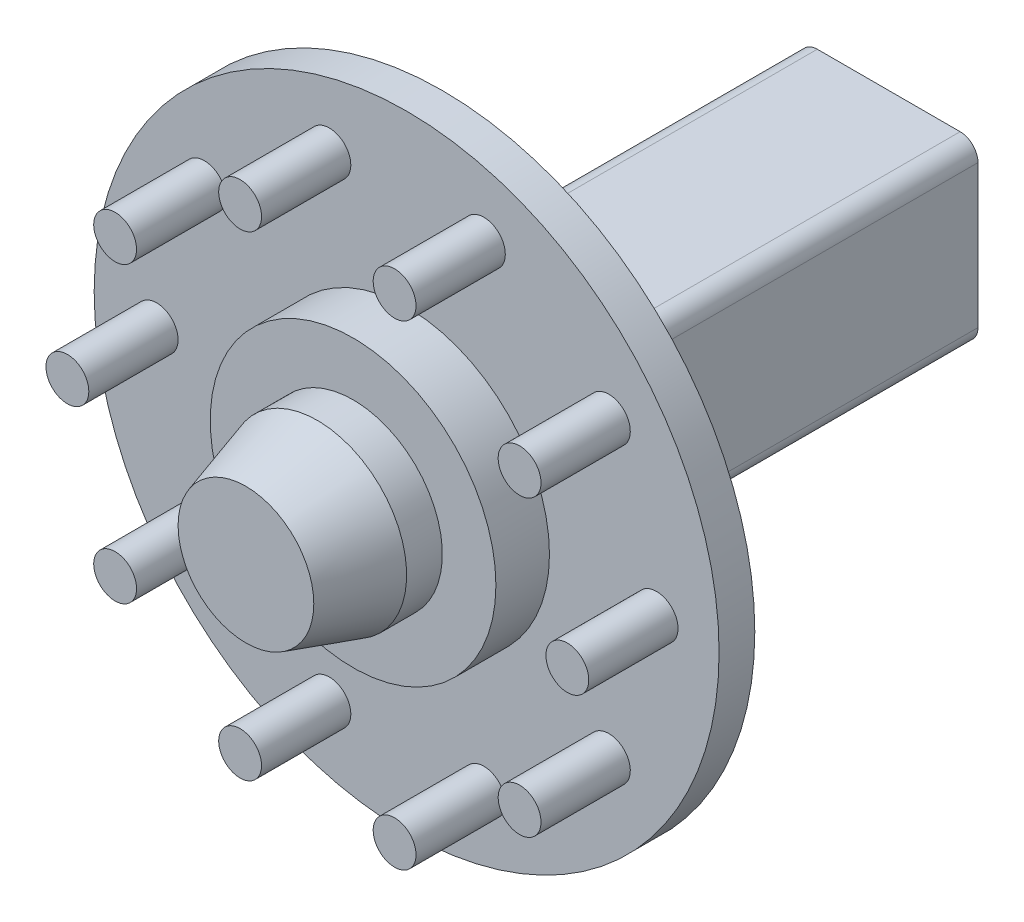
ISO-10303-21;
HEADER;
FILE_DESCRIPTION(('STEP AP214'),'2;1');
FILE_NAME('part.step','',(''),(''),'','','');
FILE_SCHEMA(('AUTOMOTIVE_DESIGN { 1 0 10303 214 1 1 1 1 }'));
ENDSEC;
DATA;
#1=APPLICATION_CONTEXT('core data for automotive mechanical design processes');
#2=APPLICATION_PROTOCOL_DEFINITION('international standard','automotive_design',2000,#1);
#3=PRODUCT_CONTEXT('',#1,'mechanical');
#4=PRODUCT('Part','Part','',(#3));
#5=PRODUCT_RELATED_PRODUCT_CATEGORY('part','',(#4));
#6=PRODUCT_DEFINITION_FORMATION('','',#4);
#7=PRODUCT_DEFINITION_CONTEXT('part definition',#1,'design');
#8=PRODUCT_DEFINITION('design','',#6,#7);
#9=PRODUCT_DEFINITION_SHAPE('','',#8);
#10=(LENGTH_UNIT() NAMED_UNIT(*) SI_UNIT(.MILLI.,.METRE.));
#11=(NAMED_UNIT(*) PLANE_ANGLE_UNIT() SI_UNIT($,.RADIAN.));
#12=(NAMED_UNIT(*) SI_UNIT($,.STERADIAN.) SOLID_ANGLE_UNIT());
#13=UNCERTAINTY_MEASURE_WITH_UNIT(LENGTH_MEASURE(1.E-05),#10,'distance_accuracy_value','');
#14=(GEOMETRIC_REPRESENTATION_CONTEXT(3) GLOBAL_UNCERTAINTY_ASSIGNED_CONTEXT((#13)) GLOBAL_UNIT_ASSIGNED_CONTEXT((#10,
#11,#12)) REPRESENTATION_CONTEXT('',''));
#15=CARTESIAN_POINT('',(0.,0.,0.));
#16=DIRECTION('',(0.,0.,1.));
#17=DIRECTION('',(1.,0.,0.));
#18=AXIS2_PLACEMENT_3D('',#15,#16,#17);
#19=CARTESIAN_POINT('',(50.0000000000001,50.0000000000002,270.));
#20=DIRECTION('',(0.,0.,1.));
#21=DIRECTION('',(1.,0.,0.));
#22=AXIS2_PLACEMENT_3D('',#19,#20,#21);
#23=PLANE('',#22);
#24=CARTESIAN_POINT('',(6.73762078750573,183.147912281322,270.));
#25=DIRECTION('',(0.,0.,1.));
#26=DIRECTION('',(0.309016994374959,-0.951056516295155,0.));
#27=AXIS2_PLACEMENT_3D('',#24,#25,#26);
#28=CIRCLE('',#27,12.);
#29=CARTESIAN_POINT('',(10.4458247200052,171.73523408578,270.));
#30=VERTEX_POINT('',#29);
#31=EDGE_CURVE('E693',#30,#30,#28,.T.);
#32=ORIENTED_EDGE('',*,*,#31,.F.);
#33=EDGE_LOOP('',(#32));
#34=FACE_BOUND('',#33,.T.);
#35=CARTESIAN_POINT('',(163.262379212492,132.289935320948,270.));
#36=DIRECTION('',(0.,0.,1.));
#37=DIRECTION('',(-0.809016994374945,-0.587785252292483,0.));
#38=AXIS2_PLACEMENT_3D('',#35,#36,#37);
#39=CIRCLE('',#38,12.);
#40=CARTESIAN_POINT('',(153.554175279993,125.236512293438,270.));
#41=VERTEX_POINT('',#40);
#42=EDGE_CURVE('E681',#41,#41,#39,.T.);
#43=ORIENTED_EDGE('',*,*,#42,.F.);
#44=EDGE_LOOP('',(#43));
#45=FACE_BOUND('',#44,.T.);
#46=CARTESIAN_POINT('',(163.262379212494,-32.2899353209456,270.));
#47=DIRECTION('',(0.,0.,1.));
#48=DIRECTION('',(-0.809016994374953,0.587785252292471,0.));
#49=AXIS2_PLACEMENT_3D('',#46,#47,#48);
#50=CIRCLE('',#49,12.);
#51=CARTESIAN_POINT('',(153.554175279994,-25.236512293436,270.));
#52=VERTEX_POINT('',#51);
#53=EDGE_CURVE('E669',#52,#52,#50,.T.);
#54=ORIENTED_EDGE('',*,*,#53,.F.);
#55=EDGE_LOOP('',(#54));
#56=FACE_BOUND('',#55,.T.);
#57=CARTESIAN_POINT('',(6.73762078750775,-83.1479122813219,270.));
#58=DIRECTION('',(0.,0.,1.));
#59=DIRECTION('',(0.309016994374945,0.951056516295159,0.));
#60=AXIS2_PLACEMENT_3D('',#57,#58,#59);
#61=CIRCLE('',#60,12.);
#62=CARTESIAN_POINT('',(10.4458247200071,-71.73523408578,270.));
#63=VERTEX_POINT('',#62);
#64=EDGE_CURVE('E657',#63,#63,#61,.T.);
#65=ORIENTED_EDGE('',*,*,#64,.F.);
#66=EDGE_LOOP('',(#65));
#67=FACE_BOUND('',#66,.T.);
#68=CARTESIAN_POINT('',(-90.0000000000002,50.0000000000003,270.));
#69=DIRECTION('',(0.,0.,1.));
#70=DIRECTION('',(1.,0.,0.));
#71=AXIS2_PLACEMENT_3D('',#68,#69,#70);
#72=CIRCLE('',#71,12.);
#73=CARTESIAN_POINT('',(-78.0000000000002,50.0000000000003,270.));
#74=VERTEX_POINT('',#73);
#75=EDGE_CURVE('E645',#74,#74,#72,.T.);
#76=ORIENTED_EDGE('',*,*,#75,.F.);
#77=EDGE_LOOP('',(#76));
#78=FACE_BOUND('',#77,.T.);
#79=CARTESIAN_POINT('',(50.0000000000001,50.0000000000002,270.));
#80=DIRECTION('',(0.,0.,1.));
#81=DIRECTION('',(1.,0.,0.));
#82=AXIS2_PLACEMENT_3D('',#79,#80,#81);
#83=CIRCLE('',#82,175.);
#84=CARTESIAN_POINT('',(225.000000000001,50.0000000000002,270.));
#85=VERTEX_POINT('',#84);
#86=EDGE_CURVE('E137',#85,#85,#83,.T.);
#87=ORIENTED_EDGE('',*,*,#86,.T.);
#88=EDGE_LOOP('',(#87));
#89=FACE_BOUND('',#88,.T.);
#90=CARTESIAN_POINT('',(50.0000000000001,50.0000000000002,270.));
#91=DIRECTION('',(0.,0.,1.));
#92=DIRECTION('',(1.,0.,0.));
#93=AXIS2_PLACEMENT_3D('',#90,#91,#92);
#94=CIRCLE('',#93,80.);
#95=CARTESIAN_POINT('',(130.,50.0000000000002,270.));
#96=VERTEX_POINT('',#95);
#97=EDGE_CURVE('E639',#96,#96,#94,.T.);
#98=ORIENTED_EDGE('',*,*,#97,.F.);
#99=EDGE_LOOP('',(#98));
#100=FACE_BOUND('',#99,.T.);
#101=CARTESIAN_POINT('',(-63.2623792124927,-32.2899353209463,270.));
#102=DIRECTION('',(0.,0.,1.));
#103=DIRECTION('',(0.809016994374949,0.587785252292477,0.));
#104=AXIS2_PLACEMENT_3D('',#101,#102,#103);
#105=CIRCLE('',#104,12.);
#106=CARTESIAN_POINT('',(-53.5541752799933,-25.2365122934366,270.));
#107=VERTEX_POINT('',#106);
#108=EDGE_CURVE('E651',#107,#107,#105,.T.);
#109=ORIENTED_EDGE('',*,*,#108,.F.);
#110=EDGE_LOOP('',(#109));
#111=FACE_BOUND('',#110,.T.);
#112=CARTESIAN_POINT('',(93.2623792124934,-83.1479122813216,270.));
#113=DIRECTION('',(0.,0.,1.));
#114=DIRECTION('',(-0.309016994374952,0.951056516295157,0.));
#115=AXIS2_PLACEMENT_3D('',#112,#113,#114);
#116=CIRCLE('',#115,12.);
#117=CARTESIAN_POINT('',(89.554175279994,-71.7352340857797,270.));
#118=VERTEX_POINT('',#117);
#119=EDGE_CURVE('E663',#118,#118,#116,.T.);
#120=ORIENTED_EDGE('',*,*,#119,.F.);
#121=EDGE_LOOP('',(#120));
#122=FACE_BOUND('',#121,.T.);
#123=CARTESIAN_POINT('',(190.,50.0000000000013,270.));
#124=DIRECTION('',(0.,0.,1.));
#125=DIRECTION('',(-1.,0.,0.));
#126=AXIS2_PLACEMENT_3D('',#123,#124,#125);
#127=CIRCLE('',#126,12.);
#128=CARTESIAN_POINT('',(178.,50.0000000000012,270.));
#129=VERTEX_POINT('',#128);
#130=EDGE_CURVE('E675',#129,#129,#127,.T.);
#131=ORIENTED_EDGE('',*,*,#130,.F.);
#132=EDGE_LOOP('',(#131));
#133=FACE_BOUND('',#132,.T.);
#134=CARTESIAN_POINT('',(93.2623792124916,183.147912281323,270.));
#135=DIRECTION('',(0.,0.,1.));
#136=DIRECTION('',(-0.309016994374939,-0.951056516295161,0.));
#137=AXIS2_PLACEMENT_3D('',#134,#135,#136);
#138=CIRCLE('',#137,12.);
#139=CARTESIAN_POINT('',(89.5541752799924,171.735234085781,270.));
#140=VERTEX_POINT('',#139);
#141=EDGE_CURVE('E687',#140,#140,#138,.T.);
#142=ORIENTED_EDGE('',*,*,#141,.F.);
#143=EDGE_LOOP('',(#142));
#144=FACE_BOUND('',#143,.T.);
#145=CARTESIAN_POINT('',(-63.2623792124939,132.289935320946,270.));
#146=DIRECTION('',(0.,0.,1.));
#147=DIRECTION('',(0.809016994374957,-0.587785252292465,0.));
#148=AXIS2_PLACEMENT_3D('',#145,#146,#147);
#149=CIRCLE('',#148,12.);
#150=CARTESIAN_POINT('',(-53.5541752799944,125.236512293436,270.));
#151=VERTEX_POINT('',#150);
#152=EDGE_CURVE('E699',#151,#151,#149,.T.);
#153=ORIENTED_EDGE('',*,*,#152,.F.);
#154=EDGE_LOOP('',(#153));
#155=FACE_BOUND('',#154,.T.);
#156=ADVANCED_FACE('F34',(#34,#45,#56,#67,#78,#89,#100,#111,#122,#133,#144,#155),#23,.T.);
#157=CARTESIAN_POINT('',(9.99999999999998,90.0000000000005,230.));
#158=DIRECTION('',(0.,0.,-1.));
#159=DIRECTION('',(-1.,0.,0.));
#160=AXIS2_PLACEMENT_3D('',#157,#158,#159);
#161=PLANE('',#160);
#162=CARTESIAN_POINT('',(50.0000000000002,50.0000000000003,230.));
#163=DIRECTION('',(0.,0.,1.));
#164=DIRECTION('',(1.,0.,0.));
#165=AXIS2_PLACEMENT_3D('',#162,#163,#164);
#166=CIRCLE('',#165,50.);
#167=CARTESIAN_POINT('',(100.,50.0000000000003,230.));
#168=VERTEX_POINT('',#167);
#169=CARTESIAN_POINT('',(50.0000000000001,100.000000000001,230.));
#170=VERTEX_POINT('',#169);
#171=EDGE_CURVE('E131',#168,#170,#166,.T.);
#172=ORIENTED_EDGE('',*,*,#171,.F.);
#173=DIRECTION('',(0.,1.,0.));
#174=VECTOR('',#173,1.);
#175=CARTESIAN_POINT('',(100.,10.0000000000001,230.));
#176=LINE('',#175,#174);
#177=CARTESIAN_POINT('',(100.,90.0000000000004,230.));
#178=VERTEX_POINT('',#177);
#179=EDGE_CURVE('E120',#168,#178,#176,.T.);
#180=ORIENTED_EDGE('',*,*,#179,.T.);
#181=CARTESIAN_POINT('',(90.0000000000003,90.0000000000004,230.000000000001));
#182=DIRECTION('',(0.,0.,1.));
#183=DIRECTION('',(-1.,0.,0.));
#184=AXIS2_PLACEMENT_3D('',#181,#182,#183);
#185=CIRCLE('',#184,9.99999999999999);
#186=CARTESIAN_POINT('',(90.0000000000003,100.000000000001,230.));
#187=VERTEX_POINT('',#186);
#188=EDGE_CURVE('E119',#178,#187,#185,.T.);
#189=ORIENTED_EDGE('',*,*,#188,.T.);
#190=DIRECTION('',(-1.,0.,0.));
#191=VECTOR('',#190,1.);
#192=CARTESIAN_POINT('',(10.0000000000001,100.000000000001,230.));
#193=LINE('',#192,#191);
#194=EDGE_CURVE('E134',#187,#170,#193,.T.);
#195=ORIENTED_EDGE('',*,*,#194,.T.);
#196=EDGE_LOOP('',(#172,#180,#189,#195));
#197=FACE_BOUND('',#196,.T.);
#198=ADVANCED_FACE('F132',(#197),#161,.F.);
#199=CARTESIAN_POINT('',(1.11022302462516E-13,50.0000000000003,230.));
#200=VERTEX_POINT('',#199);
#201=EDGE_CURVE('E50',#170,#200,#166,.T.);
#202=ORIENTED_EDGE('',*,*,#201,.F.);
#203=CARTESIAN_POINT('',(10.0000000000001,100.000000000001,230.));
#204=VERTEX_POINT('',#203);
#205=EDGE_CURVE('E182',#170,#204,#193,.T.);
#206=ORIENTED_EDGE('',*,*,#205,.T.);
#207=CARTESIAN_POINT('',(9.99999999999998,90.0000000000005,230.));
#208=DIRECTION('',(0.,0.,1.));
#209=DIRECTION('',(-1.,0.,0.));
#210=AXIS2_PLACEMENT_3D('',#207,#208,#209);
#211=CIRCLE('',#210,10.);
#212=CARTESIAN_POINT('',(0.,90.0000000000004,230.));
#213=VERTEX_POINT('',#212);
#214=EDGE_CURVE('E168',#204,#213,#211,.T.);
#215=ORIENTED_EDGE('',*,*,#214,.T.);
#216=DIRECTION('',(0.,-1.,0.));
#217=VECTOR('',#216,1.);
#218=CARTESIAN_POINT('',(1.11022302462516E-13,10.0000000000002,230.));
#219=LINE('',#218,#217);
#220=EDGE_CURVE('E172',#213,#200,#219,.T.);
#221=ORIENTED_EDGE('',*,*,#220,.T.);
#222=EDGE_LOOP('',(#202,#206,#215,#221));
#223=FACE_BOUND('',#222,.T.);
#224=ADVANCED_FACE('F228',(#223),#161,.F.);
#225=CARTESIAN_POINT('',(50.0000000000003,0.,230.));
#226=VERTEX_POINT('',#225);
#227=EDGE_CURVE('E141',#200,#226,#166,.T.);
#228=ORIENTED_EDGE('',*,*,#227,.F.);
#229=CARTESIAN_POINT('',(1.11022302462516E-13,10.0000000000002,230.));
#230=VERTEX_POINT('',#229);
#231=EDGE_CURVE('E171',#200,#230,#219,.T.);
#232=ORIENTED_EDGE('',*,*,#231,.T.);
#233=CARTESIAN_POINT('',(10.0000000000001,10.0000000000001,230.));
#234=DIRECTION('',(0.,0.,1.));
#235=DIRECTION('',(-1.,0.,0.));
#236=AXIS2_PLACEMENT_3D('',#233,#234,#235);
#237=CIRCLE('',#236,10.);
#238=CARTESIAN_POINT('',(10.0000000000001,1.11022302462516E-13,230.000000000001));
#239=VERTEX_POINT('',#238);
#240=EDGE_CURVE('E174',#230,#239,#237,.T.);
#241=ORIENTED_EDGE('',*,*,#240,.T.);
#242=DIRECTION('',(1.,0.,0.));
#243=VECTOR('',#242,1.);
#244=CARTESIAN_POINT('',(10.0000000000001,1.11022302462516E-13,230.000000000001));
#245=LINE('',#244,#243);
#246=EDGE_CURVE('E177',#239,#226,#245,.T.);
#247=ORIENTED_EDGE('',*,*,#246,.T.);
#248=EDGE_LOOP('',(#228,#232,#241,#247));
#249=FACE_BOUND('',#248,.T.);
#250=ADVANCED_FACE('F293',(#249),#161,.F.);
#251=EDGE_CURVE('E58',#226,#168,#166,.T.);
#252=ORIENTED_EDGE('',*,*,#251,.F.);
#253=CARTESIAN_POINT('',(90.0000000000004,0.,230.000000000001));
#254=VERTEX_POINT('',#253);
#255=EDGE_CURVE('E176',#226,#254,#245,.T.);
#256=ORIENTED_EDGE('',*,*,#255,.T.);
#257=CARTESIAN_POINT('',(90.0000000000002,10.,230.));
#258=DIRECTION('',(0.,0.,1.));
#259=DIRECTION('',(1.,0.,0.));
#260=AXIS2_PLACEMENT_3D('',#257,#258,#259);
#261=CIRCLE('',#260,10.);
#262=CARTESIAN_POINT('',(100.,10.0000000000001,230.));
#263=VERTEX_POINT('',#262);
#264=EDGE_CURVE('E115',#254,#263,#261,.T.);
#265=ORIENTED_EDGE('',*,*,#264,.T.);
#266=EDGE_CURVE('E111',#263,#168,#176,.T.);
#267=ORIENTED_EDGE('',*,*,#266,.T.);
#268=EDGE_LOOP('',(#252,#256,#265,#267));
#269=FACE_BOUND('',#268,.T.);
#270=ADVANCED_FACE('F113',(#269),#161,.F.);
#271=CARTESIAN_POINT('',(9.99999999999998,90.0000000000005,230.));
#272=DIRECTION('',(0.,0.,-1.));
#273=DIRECTION('',(-1.,0.,0.));
#274=AXIS2_PLACEMENT_3D('',#271,#272,#273);
#275=CYLINDRICAL_SURFACE('',#274,10.);
#276=CARTESIAN_POINT('',(10.,90.0000000000005,2.22044604925031E-13));
#277=DIRECTION('',(0.,0.,1.));
#278=DIRECTION('',(-1.,0.,0.));
#279=AXIS2_PLACEMENT_3D('',#276,#277,#278);
#280=CIRCLE('',#279,10.);
#281=CARTESIAN_POINT('',(10.0000000000001,100.000000000001,-2.22044604925031E-13));
#282=VERTEX_POINT('',#281);
#283=CARTESIAN_POINT('',(0.,90.0000000000005,2.22044604925031E-13));
#284=VERTEX_POINT('',#283);
#285=EDGE_CURVE('E151',#282,#284,#280,.T.);
#286=ORIENTED_EDGE('',*,*,#285,.T.);
#287=DIRECTION('',(0.,0.,-1.));
#288=VECTOR('',#287,1.);
#289=CARTESIAN_POINT('',(0.,90.0000000000004,230.));
#290=LINE('',#289,#288);
#291=EDGE_CURVE('E142',#213,#284,#290,.T.);
#292=ORIENTED_EDGE('',*,*,#291,.F.);
#293=ORIENTED_EDGE('',*,*,#214,.F.);
#294=DIRECTION('',(0.,0.,-1.));
#295=VECTOR('',#294,1.);
#296=CARTESIAN_POINT('',(10.0000000000001,100.000000000001,230.));
#297=LINE('',#296,#295);
#298=EDGE_CURVE('E184',#204,#282,#297,.T.);
#299=ORIENTED_EDGE('',*,*,#298,.T.);
#300=EDGE_LOOP('',(#286,#292,#293,#299));
#301=FACE_BOUND('',#300,.T.);
#302=ADVANCED_FACE('F36',(#301),#275,.T.);
#303=CARTESIAN_POINT('',(1.11022302462516E-13,10.0000000000002,230.));
#304=DIRECTION('',(1.,0.,0.));
#305=DIRECTION('',(0.,0.,-1.));
#306=AXIS2_PLACEMENT_3D('',#303,#304,#305);
#307=PLANE('',#306);
#308=DIRECTION('',(0.,-1.,0.));
#309=VECTOR('',#308,1.);
#310=CARTESIAN_POINT('',(0.,10.0000000000002,0.));
#311=LINE('',#310,#309);
#312=CARTESIAN_POINT('',(0.,10.0000000000002,0.));
#313=VERTEX_POINT('',#312);
#314=EDGE_CURVE('E154',#284,#313,#311,.T.);
#315=ORIENTED_EDGE('',*,*,#314,.T.);
#316=DIRECTION('',(0.,0.,-1.));
#317=VECTOR('',#316,1.);
#318=CARTESIAN_POINT('',(1.11022302462516E-13,10.0000000000002,230.));
#319=LINE('',#318,#317);
#320=EDGE_CURVE('E144',#230,#313,#319,.T.);
#321=ORIENTED_EDGE('',*,*,#320,.F.);
#322=ORIENTED_EDGE('',*,*,#231,.F.);
#323=ORIENTED_EDGE('',*,*,#220,.F.);
#324=ORIENTED_EDGE('',*,*,#291,.T.);
#325=EDGE_LOOP('',(#315,#321,#322,#323,#324));
#326=FACE_BOUND('',#325,.T.);
#327=ADVANCED_FACE('F267',(#326),#307,.F.);
#328=CARTESIAN_POINT('',(10.0000000000001,10.0000000000001,230.));
#329=DIRECTION('',(0.,0.,-1.));
#330=DIRECTION('',(-1.,0.,0.));
#331=AXIS2_PLACEMENT_3D('',#328,#329,#330);
#332=CYLINDRICAL_SURFACE('',#331,10.);
#333=CARTESIAN_POINT('',(10.,10.0000000000002,2.22044604925031E-13));
#334=DIRECTION('',(0.,0.,1.));
#335=DIRECTION('',(-1.,0.,0.));
#336=AXIS2_PLACEMENT_3D('',#333,#334,#335);
#337=CIRCLE('',#336,10.);
#338=CARTESIAN_POINT('',(10.0000000000001,0.,4.44089209850063E-13));
#339=VERTEX_POINT('',#338);
#340=EDGE_CURVE('E156',#313,#339,#337,.T.);
#341=ORIENTED_EDGE('',*,*,#340,.T.);
#342=DIRECTION('',(0.,0.,-1.));
#343=VECTOR('',#342,1.);
#344=CARTESIAN_POINT('',(10.0000000000001,1.11022302462516E-13,230.000000000001));
#345=LINE('',#344,#343);
#346=EDGE_CURVE('E196',#239,#339,#345,.T.);
#347=ORIENTED_EDGE('',*,*,#346,.F.);
#348=ORIENTED_EDGE('',*,*,#240,.F.);
#349=ORIENTED_EDGE('',*,*,#320,.T.);
#350=EDGE_LOOP('',(#341,#347,#348,#349));
#351=FACE_BOUND('',#350,.T.);
#352=ADVANCED_FACE('F264',(#351),#332,.T.);
#353=CARTESIAN_POINT('',(10.0000000000001,1.11022302462516E-13,230.000000000001));
#354=DIRECTION('',(0.,1.,0.));
#355=DIRECTION('',(0.,0.,1.));
#356=AXIS2_PLACEMENT_3D('',#353,#354,#355);
#357=PLANE('',#356);
#358=DIRECTION('',(1.,0.,0.));
#359=VECTOR('',#358,1.);
#360=CARTESIAN_POINT('',(10.0000000000001,0.,4.44089209850063E-13));
#361=LINE('',#360,#359);
#362=CARTESIAN_POINT('',(90.0000000000001,0.,4.44089209850063E-13));
#363=VERTEX_POINT('',#362);
#364=EDGE_CURVE('E158',#339,#363,#361,.T.);
#365=ORIENTED_EDGE('',*,*,#364,.T.);
#366=DIRECTION('',(0.,0.,-1.));
#367=VECTOR('',#366,1.);
#368=CARTESIAN_POINT('',(90.0000000000004,0.,230.000000000001));
#369=LINE('',#368,#367);
#370=EDGE_CURVE('E193',#254,#363,#369,.T.);
#371=ORIENTED_EDGE('',*,*,#370,.F.);
#372=ORIENTED_EDGE('',*,*,#255,.F.);
#373=ORIENTED_EDGE('',*,*,#246,.F.);
#374=ORIENTED_EDGE('',*,*,#346,.T.);
#375=EDGE_LOOP('',(#365,#371,#372,#373,#374));
#376=FACE_BOUND('',#375,.T.);
#377=ADVANCED_FACE('F260',(#376),#357,.F.);
#378=CARTESIAN_POINT('',(90.0000000000002,10.,230.));
#379=DIRECTION('',(0.,0.,-1.));
#380=DIRECTION('',(-1.,0.,0.));
#381=AXIS2_PLACEMENT_3D('',#378,#379,#380);
#382=CYLINDRICAL_SURFACE('',#381,10.);
#383=CARTESIAN_POINT('',(90.0000000000002,10.0000000000001,-2.22044604925031E-13));
#384=DIRECTION('',(0.,0.,1.));
#385=DIRECTION('',(1.,0.,0.));
#386=AXIS2_PLACEMENT_3D('',#383,#384,#385);
#387=CIRCLE('',#386,10.);
#388=CARTESIAN_POINT('',(100.,10.0000000000001,-2.22044604925031E-13));
#389=VERTEX_POINT('',#388);
#390=EDGE_CURVE('E160',#363,#389,#387,.T.);
#391=ORIENTED_EDGE('',*,*,#390,.T.);
#392=DIRECTION('',(0.,0.,-1.));
#393=VECTOR('',#392,1.);
#394=CARTESIAN_POINT('',(100.,10.0000000000001,230.));
#395=LINE('',#394,#393);
#396=EDGE_CURVE('E191',#263,#389,#395,.T.);
#397=ORIENTED_EDGE('',*,*,#396,.F.);
#398=ORIENTED_EDGE('',*,*,#264,.F.);
#399=ORIENTED_EDGE('',*,*,#370,.T.);
#400=EDGE_LOOP('',(#391,#397,#398,#399));
#401=FACE_BOUND('',#400,.T.);
#402=ADVANCED_FACE('F257',(#401),#382,.T.);
#403=CARTESIAN_POINT('',(100.,10.0000000000001,230.));
#404=DIRECTION('',(-1.,0.,0.));
#405=DIRECTION('',(0.,0.,1.));
#406=AXIS2_PLACEMENT_3D('',#403,#404,#405);
#407=PLANE('',#406);
#408=DIRECTION('',(0.,1.,0.));
#409=VECTOR('',#408,1.);
#410=CARTESIAN_POINT('',(100.,10.0000000000002,-2.22044604925031E-13));
#411=LINE('',#410,#409);
#412=CARTESIAN_POINT('',(100.,90.0000000000005,-2.22044604925031E-13));
#413=VERTEX_POINT('',#412);
#414=EDGE_CURVE('E162',#389,#413,#411,.T.);
#415=ORIENTED_EDGE('',*,*,#414,.T.);
#416=DIRECTION('',(0.,0.,-1.));
#417=VECTOR('',#416,1.);
#418=CARTESIAN_POINT('',(100.,90.0000000000004,230.));
#419=LINE('',#418,#417);
#420=EDGE_CURVE('E126',#178,#413,#419,.T.);
#421=ORIENTED_EDGE('',*,*,#420,.F.);
#422=ORIENTED_EDGE('',*,*,#179,.F.);
#423=ORIENTED_EDGE('',*,*,#266,.F.);
#424=ORIENTED_EDGE('',*,*,#396,.T.);
#425=EDGE_LOOP('',(#415,#421,#422,#423,#424));
#426=FACE_BOUND('',#425,.T.);
#427=ADVANCED_FACE('F124',(#426),#407,.F.);
#428=CARTESIAN_POINT('',(90.0000000000003,90.0000000000004,230.000000000001));
#429=DIRECTION('',(0.,0.,-1.));
#430=DIRECTION('',(-1.,0.,0.));
#431=AXIS2_PLACEMENT_3D('',#428,#429,#430);
#432=CYLINDRICAL_SURFACE('',#431,9.99999999999999);
#433=CARTESIAN_POINT('',(90.0000000000001,90.0000000000004,0.));
#434=DIRECTION('',(0.,0.,1.));
#435=DIRECTION('',(-1.,0.,0.));
#436=AXIS2_PLACEMENT_3D('',#433,#434,#435);
#437=CIRCLE('',#436,9.99999999999999);
#438=CARTESIAN_POINT('',(90.0000000000001,100.000000000001,-1.11022302462516E-13));
#439=VERTEX_POINT('',#438);
#440=EDGE_CURVE('E164',#413,#439,#437,.T.);
#441=ORIENTED_EDGE('',*,*,#440,.T.);
#442=DIRECTION('',(0.,0.,-1.));
#443=VECTOR('',#442,1.);
#444=CARTESIAN_POINT('',(90.0000000000003,100.000000000001,230.));
#445=LINE('',#444,#443);
#446=EDGE_CURVE('E187',#187,#439,#445,.T.);
#447=ORIENTED_EDGE('',*,*,#446,.F.);
#448=ORIENTED_EDGE('',*,*,#188,.F.);
#449=ORIENTED_EDGE('',*,*,#420,.T.);
#450=EDGE_LOOP('',(#441,#447,#448,#449));
#451=FACE_BOUND('',#450,.T.);
#452=ADVANCED_FACE('F250',(#451),#432,.T.);
#453=CARTESIAN_POINT('',(10.0000000000001,100.000000000001,230.));
#454=DIRECTION('',(0.,-1.,0.));
#455=DIRECTION('',(0.,0.,-1.));
#456=AXIS2_PLACEMENT_3D('',#453,#454,#455);
#457=PLANE('',#456);
#458=DIRECTION('',(-1.,0.,0.));
#459=VECTOR('',#458,1.);
#460=CARTESIAN_POINT('',(10.0000000000001,100.000000000001,-2.22044604925031E-13));
#461=LINE('',#460,#459);
#462=EDGE_CURVE('E166',#439,#282,#461,.T.);
#463=ORIENTED_EDGE('',*,*,#462,.T.);
#464=ORIENTED_EDGE('',*,*,#298,.F.);
#465=ORIENTED_EDGE('',*,*,#205,.F.);
#466=ORIENTED_EDGE('',*,*,#194,.F.);
#467=ORIENTED_EDGE('',*,*,#446,.T.);
#468=EDGE_LOOP('',(#463,#464,#465,#466,#467));
#469=FACE_BOUND('',#468,.T.);
#470=ADVANCED_FACE('F245',(#469),#457,.F.);
#471=CARTESIAN_POINT('',(10.,90.0000000000005,2.22044604925031E-13));
#472=DIRECTION('',(0.,0.,-1.));
#473=DIRECTION('',(-1.,0.,0.));
#474=AXIS2_PLACEMENT_3D('',#471,#472,#473);
#475=PLANE('',#474);
#476=ORIENTED_EDGE('',*,*,#285,.F.);
#477=ORIENTED_EDGE('',*,*,#462,.F.);
#478=ORIENTED_EDGE('',*,*,#440,.F.);
#479=ORIENTED_EDGE('',*,*,#414,.F.);
#480=ORIENTED_EDGE('',*,*,#390,.F.);
#481=ORIENTED_EDGE('',*,*,#364,.F.);
#482=ORIENTED_EDGE('',*,*,#340,.F.);
#483=ORIENTED_EDGE('',*,*,#314,.F.);
#484=EDGE_LOOP('',(#476,#477,#478,#479,#480,#481,#482,#483));
#485=FACE_BOUND('',#484,.T.);
#486=ADVANCED_FACE('F242',(#485),#475,.T.);
#487=CARTESIAN_POINT('',(50.0000000000003,50.0000000000005,250.));
#488=DIRECTION('',(0.,0.,-1.));
#489=DIRECTION('',(-1.,0.,0.));
#490=AXIS2_PLACEMENT_3D('',#487,#488,#489);
#491=CYLINDRICAL_SURFACE('',#490,50.);
#492=CARTESIAN_POINT('',(50.0000000000003,50.0000000000005,250.));
#493=DIRECTION('',(0.,0.,1.));
#494=DIRECTION('',(1.,0.,0.));
#495=AXIS2_PLACEMENT_3D('',#492,#493,#494);
#496=CIRCLE('',#495,50.);
#497=CARTESIAN_POINT('',(100.,50.0000000000005,250.));
#498=VERTEX_POINT('',#497);
#499=EDGE_CURVE('E136',#498,#498,#496,.T.);
#500=ORIENTED_EDGE('',*,*,#499,.F.);
#501=EDGE_LOOP('',(#500));
#502=FACE_BOUND('',#501,.T.);
#503=ORIENTED_EDGE('',*,*,#171,.T.);
#504=ORIENTED_EDGE('',*,*,#201,.T.);
#505=ORIENTED_EDGE('',*,*,#227,.T.);
#506=ORIENTED_EDGE('',*,*,#251,.T.);
#507=EDGE_LOOP('',(#503,#504,#505,#506));
#508=FACE_BOUND('',#507,.T.);
#509=ADVANCED_FACE('F140',(#502,#508),#491,.T.);
#510=CARTESIAN_POINT('',(50.0000000000003,50.0000000000005,250.));
#511=DIRECTION('',(0.,0.,1.));
#512=DIRECTION('',(1.,0.,0.));
#513=AXIS2_PLACEMENT_3D('',#510,#511,#512);
#514=PLANE('',#513);
#515=CARTESIAN_POINT('',(50.0000000000003,50.0000000000005,250.));
#516=DIRECTION('',(0.,0.,1.));
#517=DIRECTION('',(1.,0.,0.));
#518=AXIS2_PLACEMENT_3D('',#515,#516,#517);
#519=CIRCLE('',#518,175.);
#520=CARTESIAN_POINT('',(225.000000000001,50.0000000000004,250.));
#521=VERTEX_POINT('',#520);
#522=EDGE_CURVE('E630',#521,#521,#519,.T.);
#523=ORIENTED_EDGE('',*,*,#522,.F.);
#524=EDGE_LOOP('',(#523));
#525=FACE_BOUND('',#524,.T.);
#526=ORIENTED_EDGE('',*,*,#499,.T.);
#527=EDGE_LOOP('',(#526));
#528=FACE_BOUND('',#527,.T.);
#529=ADVANCED_FACE('F234',(#525,#528),#514,.F.);
#530=CARTESIAN_POINT('',(50.0000000000001,50.0000000000002,270.));
#531=DIRECTION('',(0.,0.,-1.));
#532=DIRECTION('',(-1.,0.,0.));
#533=AXIS2_PLACEMENT_3D('',#530,#531,#532);
#534=CYLINDRICAL_SURFACE('',#533,175.);
#535=ORIENTED_EDGE('',*,*,#86,.F.);
#536=EDGE_LOOP('',(#535));
#537=FACE_BOUND('',#536,.T.);
#538=ORIENTED_EDGE('',*,*,#522,.T.);
#539=EDGE_LOOP('',(#538));
#540=FACE_BOUND('',#539,.T.);
#541=ADVANCED_FACE('F235',(#537,#540),#534,.T.);
#542=CARTESIAN_POINT('',(50.0000000000002,50.0000000000004,300.000000000001));
#543=DIRECTION('',(0.,0.,1.));
#544=DIRECTION('',(1.,0.,0.));
#545=AXIS2_PLACEMENT_3D('',#542,#543,#544);
#546=PLANE('',#545);
#547=CARTESIAN_POINT('',(50.0000000000002,50.0000000000004,300.000000000001));
#548=DIRECTION('',(0.,0.,1.));
#549=DIRECTION('',(1.,0.,0.));
#550=AXIS2_PLACEMENT_3D('',#547,#548,#549);
#551=CIRCLE('',#550,80.);
#552=CARTESIAN_POINT('',(130.,50.0000000000004,300.000000000001));
#553=VERTEX_POINT('',#552);
#554=EDGE_CURVE('E635',#553,#553,#551,.T.);
#555=ORIENTED_EDGE('',*,*,#554,.T.);
#556=EDGE_LOOP('',(#555));
#557=FACE_BOUND('',#556,.T.);
#558=CARTESIAN_POINT('',(50.0000000000002,50.0000000000004,300.000000000001));
#559=DIRECTION('',(0.,0.,1.));
#560=DIRECTION('',(1.,0.,0.));
#561=AXIS2_PLACEMENT_3D('',#558,#559,#560);
#562=CIRCLE('',#561,50.);
#563=CARTESIAN_POINT('',(0.,50.0000000000004,300.000000000001));
#564=VERTEX_POINT('',#563);
#565=EDGE_CURVE('E38',#564,#564,#562,.T.);
#566=ORIENTED_EDGE('',*,*,#565,.F.);
#567=EDGE_LOOP('',(#566));
#568=FACE_BOUND('',#567,.T.);
#569=ADVANCED_FACE('F238',(#557,#568),#546,.T.);
#570=CARTESIAN_POINT('',(50.0000000000002,50.0000000000004,300.000000000001));
#571=DIRECTION('',(0.,0.,-1.));
#572=DIRECTION('',(-1.,0.,0.));
#573=AXIS2_PLACEMENT_3D('',#570,#571,#572);
#574=CYLINDRICAL_SURFACE('',#573,80.);
#575=ORIENTED_EDGE('',*,*,#554,.F.);
#576=EDGE_LOOP('',(#575));
#577=FACE_BOUND('',#576,.T.);
#578=ORIENTED_EDGE('',*,*,#97,.T.);
#579=EDGE_LOOP('',(#578));
#580=FACE_BOUND('',#579,.T.);
#581=ADVANCED_FACE('F218',(#577,#580),#574,.T.);
#582=CARTESIAN_POINT('',(50.0000000000002,50.0000000000004,360.));
#583=DIRECTION('',(0.,0.,1.));
#584=DIRECTION('',(1.,0.,0.));
#585=AXIS2_PLACEMENT_3D('',#582,#583,#584);
#586=PLANE('',#585);
#587=CARTESIAN_POINT('',(50.0000000000002,50.0000000000004,360.));
#588=DIRECTION('',(0.,0.,1.));
#589=DIRECTION('',(1.,0.,0.));
#590=AXIS2_PLACEMENT_3D('',#587,#588,#589);
#591=CIRCLE('',#590,38.0000000000001);
#592=CARTESIAN_POINT('',(88.0000000000004,50.0000000000004,360.));
#593=VERTEX_POINT('',#592);
#594=EDGE_CURVE('E43',#593,#593,#591,.T.);
#595=ORIENTED_EDGE('',*,*,#594,.T.);
#596=EDGE_LOOP('',(#595));
#597=FACE_BOUND('',#596,.T.);
#598=ADVANCED_FACE('F204',(#597),#586,.T.);
#599=CARTESIAN_POINT('',(50.0000000000002,50.0000000000004,360.));
#600=DIRECTION('',(0.,0.,-1.));
#601=DIRECTION('',(-1.,0.,0.));
#602=AXIS2_PLACEMENT_3D('',#599,#600,#601);
#603=CONICAL_SURFACE('',#602,38.0000000000001,0.291456794477864);
#604=CARTESIAN_POINT('',(50.,50.0000000000004,320.));
#605=DIRECTION('',(0.,0.,1.));
#606=DIRECTION('',(1.,0.,0.));
#607=AXIS2_PLACEMENT_3D('',#604,#605,#606);
#608=CIRCLE('',#607,50.);
#609=CARTESIAN_POINT('',(0.,50.0000000000004,320.));
#610=VERTEX_POINT('',#609);
#611=EDGE_CURVE('E11',#610,#610,#608,.F.);
#612=ORIENTED_EDGE('',*,*,#611,.F.);
#613=EDGE_LOOP('',(#612));
#614=FACE_BOUND('',#613,.T.);
#615=ORIENTED_EDGE('',*,*,#594,.F.);
#616=EDGE_LOOP('',(#615));
#617=FACE_BOUND('',#616,.T.);
#618=ADVANCED_FACE('F206',(#614,#617),#603,.T.);
#619=CARTESIAN_POINT('',(50.0000000000002,50.0000000000004,360.));
#620=DIRECTION('',(0.,0.,-1.));
#621=DIRECTION('',(-1.,0.,0.));
#622=AXIS2_PLACEMENT_3D('',#619,#620,#621);
#623=CYLINDRICAL_SURFACE('',#622,50.);
#624=CARTESIAN_POINT('',(0.,50.0000000000004,300.000000000001));
#625=CARTESIAN_POINT('',(0.,50.0000000000004,300.208333333334));
#626=CARTESIAN_POINT('',(0.,50.0000000000004,300.416666666667));
#627=CARTESIAN_POINT('',(0.,50.0000000000004,300.833333333334));
#628=CARTESIAN_POINT('',(0.,50.0000000000004,301.041666666667));
#629=CARTESIAN_POINT('',(0.,50.0000000000004,301.458333333334));
#630=CARTESIAN_POINT('',(0.,50.0000000000004,301.666666666667));
#631=CARTESIAN_POINT('',(0.,50.0000000000004,302.083333333334));
#632=CARTESIAN_POINT('',(0.,50.0000000000004,302.291666666667));
#633=CARTESIAN_POINT('',(0.,50.0000000000004,302.708333333334));
#634=CARTESIAN_POINT('',(0.,50.0000000000004,302.916666666667));
#635=CARTESIAN_POINT('',(0.,50.0000000000004,303.333333333334));
#636=CARTESIAN_POINT('',(0.,50.0000000000004,303.541666666667));
#637=CARTESIAN_POINT('',(0.,50.0000000000004,303.958333333334));
#638=CARTESIAN_POINT('',(0.,50.0000000000004,304.166666666667));
#639=CARTESIAN_POINT('',(0.,50.0000000000004,304.583333333334));
#640=CARTESIAN_POINT('',(0.,50.0000000000004,304.791666666667));
#641=CARTESIAN_POINT('',(0.,50.0000000000004,305.208333333334));
#642=CARTESIAN_POINT('',(0.,50.0000000000004,305.416666666667));
#643=CARTESIAN_POINT('',(0.,50.0000000000004,305.833333333334));
#644=CARTESIAN_POINT('',(0.,50.0000000000004,306.041666666667));
#645=CARTESIAN_POINT('',(0.,50.0000000000004,306.458333333334));
#646=CARTESIAN_POINT('',(0.,50.0000000000004,306.666666666667));
#647=CARTESIAN_POINT('',(0.,50.0000000000004,307.083333333334));
#648=CARTESIAN_POINT('',(0.,50.0000000000004,307.291666666667));
#649=CARTESIAN_POINT('',(0.,50.0000000000004,307.708333333334));
#650=CARTESIAN_POINT('',(0.,50.0000000000004,307.916666666667));
#651=CARTESIAN_POINT('',(0.,50.0000000000004,308.333333333334));
#652=CARTESIAN_POINT('',(0.,50.0000000000004,308.541666666667));
#653=CARTESIAN_POINT('',(0.,50.0000000000004,308.958333333334));
#654=CARTESIAN_POINT('',(0.,50.0000000000004,309.166666666667));
#655=CARTESIAN_POINT('',(0.,50.0000000000004,309.583333333334));
#656=CARTESIAN_POINT('',(0.,50.0000000000004,309.791666666667));
#657=CARTESIAN_POINT('',(0.,50.0000000000004,310.208333333334));
#658=CARTESIAN_POINT('',(0.,50.0000000000004,310.416666666667));
#659=CARTESIAN_POINT('',(0.,50.0000000000004,310.833333333334));
#660=CARTESIAN_POINT('',(0.,50.0000000000004,311.041666666667));
#661=CARTESIAN_POINT('',(0.,50.0000000000004,311.458333333334));
#662=CARTESIAN_POINT('',(0.,50.0000000000004,311.666666666667));
#663=CARTESIAN_POINT('',(0.,50.0000000000004,312.083333333334));
#664=CARTESIAN_POINT('',(0.,50.0000000000004,312.291666666667));
#665=CARTESIAN_POINT('',(0.,50.0000000000004,312.708333333334));
#666=CARTESIAN_POINT('',(0.,50.0000000000004,312.916666666667));
#667=CARTESIAN_POINT('',(0.,50.0000000000004,313.333333333334));
#668=CARTESIAN_POINT('',(0.,50.0000000000004,313.541666666667));
#669=CARTESIAN_POINT('',(0.,50.0000000000004,313.958333333334));
#670=CARTESIAN_POINT('',(0.,50.0000000000004,314.166666666667));
#671=CARTESIAN_POINT('',(0.,50.0000000000004,314.583333333334));
#672=CARTESIAN_POINT('',(0.,50.0000000000004,314.791666666667));
#673=CARTESIAN_POINT('',(0.,50.0000000000004,315.208333333334));
#674=CARTESIAN_POINT('',(0.,50.0000000000004,315.416666666667));
#675=CARTESIAN_POINT('',(0.,50.0000000000004,315.833333333334));
#676=CARTESIAN_POINT('',(0.,50.0000000000004,316.041666666667));
#677=CARTESIAN_POINT('',(0.,50.0000000000004,316.458333333333));
#678=CARTESIAN_POINT('',(0.,50.0000000000004,316.666666666667));
#679=CARTESIAN_POINT('',(0.,50.0000000000004,317.083333333333));
#680=CARTESIAN_POINT('',(0.,50.0000000000004,317.291666666667));
#681=CARTESIAN_POINT('',(0.,50.0000000000004,317.708333333333));
#682=CARTESIAN_POINT('',(0.,50.0000000000004,317.916666666667));
#683=CARTESIAN_POINT('',(0.,50.0000000000004,318.333333333333));
#684=CARTESIAN_POINT('',(0.,50.0000000000004,318.541666666667));
#685=CARTESIAN_POINT('',(0.,50.0000000000004,318.958333333333));
#686=CARTESIAN_POINT('',(0.,50.0000000000004,319.166666666667));
#687=CARTESIAN_POINT('',(0.,50.0000000000004,319.583333333333));
#688=CARTESIAN_POINT('',(0.,50.0000000000004,319.791666666667));
#689=CARTESIAN_POINT('',(0.,50.0000000000004,320.));
#690=B_SPLINE_CURVE_WITH_KNOTS('',3,(#624,#625,#626,#627,#628,#629,#630,#631,#632,#633,#634,
#635,#636,#637,#638,#639,#640,#641,#642,#643,#644,#645,#646,#647,#648,#649,#650,#651,#652,#653,
#654,#655,#656,#657,#658,#659,#660,#661,#662,#663,#664,#665,#666,#667,#668,#669,#670,#671,#672,
#673,#674,#675,#676,#677,#678,#679,#680,#681,#682,#683,#684,#685,#686,#687,#688,#689),
.UNSPECIFIED.,.F.,.F.,(4,2,2,2,2,2,2,2,2,2,2,2,2,2,2,2,2,2,2,2,2,2,2,2,2,2,2,2,2,2,2,2,4),(0.,
0.624999999999987,1.24999999999997,1.87499999999996,2.49999999999995,3.12499999999993,
3.74999999999992,4.37499999999991,4.99999999999989,5.62499999999988,6.24999999999987,
6.87499999999985,7.49999999999984,8.12499999999983,8.74999999999981,9.3749999999998,
9.99999999999979,10.6249999999998,11.2499999999998,11.8749999999997,12.4999999999997,
13.1249999999997,13.7499999999997,14.3749999999997,14.9999999999997,15.6249999999997,
16.2499999999997,16.8749999999996,17.4999999999996,18.1249999999996,18.7499999999996,
19.3749999999996,19.9999999999996),.UNSPECIFIED.);
#691=EDGE_CURVE('BSEAM208',#564,#610,#690,.T.);
#692=ORIENTED_EDGE('',*,*,#565,.T.);
#693=ORIENTED_EDGE('',*,*,#611,.T.);
#694=ORIENTED_EDGE('',*,*,#691,.T.);
#695=ORIENTED_EDGE('',*,*,#691,.F.);
#696=EDGE_LOOP('',(#692,#694,#693,#695));
#697=FACE_BOUND('',#696,.T.);
#698=ADVANCED_FACE('F208',(#697),#623,.T.);
#699=CARTESIAN_POINT('',(-90.0000000000002,50.0000000000004,320.));
#700=DIRECTION('',(0.,0.,-1.));
#701=DIRECTION('',(-1.,0.,0.));
#702=AXIS2_PLACEMENT_3D('',#699,#700,#701);
#703=CYLINDRICAL_SURFACE('',#702,12.);
#704=CARTESIAN_POINT('',(-90.0000000000002,50.0000000000004,320.));
#705=DIRECTION('',(0.,0.,1.));
#706=DIRECTION('',(1.,0.,0.));
#707=AXIS2_PLACEMENT_3D('',#704,#705,#706);
#708=CIRCLE('',#707,12.);
#709=CARTESIAN_POINT('',(-78.0000000000001,50.0000000000004,320.));
#710=VERTEX_POINT('',#709);
#711=EDGE_CURVE('E642',#710,#710,#708,.T.);
#712=ORIENTED_EDGE('',*,*,#711,.F.);
#713=EDGE_LOOP('',(#712));
#714=FACE_BOUND('',#713,.T.);
#715=ORIENTED_EDGE('',*,*,#75,.T.);
#716=EDGE_LOOP('',(#715));
#717=FACE_BOUND('',#716,.T.);
#718=ADVANCED_FACE('F215',(#714,#717),#703,.T.);
#719=CARTESIAN_POINT('',(-90.0000000000002,50.0000000000004,320.));
#720=DIRECTION('',(0.,0.,1.));
#721=DIRECTION('',(1.,0.,0.));
#722=AXIS2_PLACEMENT_3D('',#719,#720,#721);
#723=PLANE('',#722);
#724=ORIENTED_EDGE('',*,*,#711,.T.);
#725=EDGE_LOOP('',(#724));
#726=FACE_BOUND('',#725,.T.);
#727=ADVANCED_FACE('F316',(#726),#723,.T.);
#728=CARTESIAN_POINT('',(-63.2623792124927,-32.2899353209465,320.));
#729=DIRECTION('',(0.,0.,-1.));
#730=DIRECTION('',(-1.,0.,0.));
#731=AXIS2_PLACEMENT_3D('',#728,#729,#730);
#732=CYLINDRICAL_SURFACE('',#731,12.);
#733=CARTESIAN_POINT('',(-63.2623792124927,-32.2899353209465,320.));
#734=DIRECTION('',(0.,0.,1.));
#735=DIRECTION('',(0.809016994374949,0.587785252292477,0.));
#736=AXIS2_PLACEMENT_3D('',#733,#734,#735);
#737=CIRCLE('',#736,12.);
#738=CARTESIAN_POINT('',(-53.5541752799933,-25.2365122934368,320.));
#739=VERTEX_POINT('',#738);
#740=EDGE_CURVE('E648',#739,#739,#737,.T.);
#741=ORIENTED_EDGE('',*,*,#740,.F.);
#742=EDGE_LOOP('',(#741));
#743=FACE_BOUND('',#742,.T.);
#744=ORIENTED_EDGE('',*,*,#108,.T.);
#745=EDGE_LOOP('',(#744));
#746=FACE_BOUND('',#745,.T.);
#747=ADVANCED_FACE('F321',(#743,#746),#732,.T.);
#748=CARTESIAN_POINT('',(-63.2623792124927,-32.2899353209465,320.));
#749=DIRECTION('',(0.,0.,1.));
#750=DIRECTION('',(0.809016994374949,0.587785252292477,0.));
#751=AXIS2_PLACEMENT_3D('',#748,#749,#750);
#752=PLANE('',#751);
#753=ORIENTED_EDGE('',*,*,#740,.T.);
#754=EDGE_LOOP('',(#753));
#755=FACE_BOUND('',#754,.T.);
#756=ADVANCED_FACE('F327',(#755),#752,.T.);
#757=CARTESIAN_POINT('',(6.73762078750776,-83.147912281322,320.));
#758=DIRECTION('',(0.,0.,-1.));
#759=DIRECTION('',(-1.,0.,0.));
#760=AXIS2_PLACEMENT_3D('',#757,#758,#759);
#761=CYLINDRICAL_SURFACE('',#760,12.);
#762=CARTESIAN_POINT('',(6.73762078750776,-83.147912281322,320.));
#763=DIRECTION('',(0.,0.,1.));
#764=DIRECTION('',(0.309016994374945,0.951056516295159,0.));
#765=AXIS2_PLACEMENT_3D('',#762,#763,#764);
#766=CIRCLE('',#765,12.);
#767=CARTESIAN_POINT('',(10.4458247200071,-71.7352340857801,320.));
#768=VERTEX_POINT('',#767);
#769=EDGE_CURVE('E654',#768,#768,#766,.T.);
#770=ORIENTED_EDGE('',*,*,#769,.F.);
#771=EDGE_LOOP('',(#770));
#772=FACE_BOUND('',#771,.T.);
#773=ORIENTED_EDGE('',*,*,#64,.T.);
#774=EDGE_LOOP('',(#773));
#775=FACE_BOUND('',#774,.T.);
#776=ADVANCED_FACE('F336',(#772,#775),#761,.T.);
#777=CARTESIAN_POINT('',(6.73762078750776,-83.147912281322,320.));
#778=DIRECTION('',(0.,0.,1.));
#779=DIRECTION('',(0.309016994374945,0.951056516295159,0.));
#780=AXIS2_PLACEMENT_3D('',#777,#778,#779);
#781=PLANE('',#780);
#782=ORIENTED_EDGE('',*,*,#769,.T.);
#783=EDGE_LOOP('',(#782));
#784=FACE_BOUND('',#783,.T.);
#785=ADVANCED_FACE('F345',(#784),#781,.T.);
#786=CARTESIAN_POINT('',(93.2623792124937,-83.1479122813215,320.));
#787=DIRECTION('',(0.,0.,-1.));
#788=DIRECTION('',(-1.,0.,0.));
#789=AXIS2_PLACEMENT_3D('',#786,#787,#788);
#790=CYLINDRICAL_SURFACE('',#789,12.);
#791=CARTESIAN_POINT('',(93.2623792124937,-83.1479122813215,320.));
#792=DIRECTION('',(0.,0.,1.));
#793=DIRECTION('',(-0.309016994374952,0.951056516295157,0.));
#794=AXIS2_PLACEMENT_3D('',#791,#792,#793);
#795=CIRCLE('',#794,12.);
#796=CARTESIAN_POINT('',(89.5541752799943,-71.7352340857797,320.));
#797=VERTEX_POINT('',#796);
#798=EDGE_CURVE('E660',#797,#797,#795,.T.);
#799=ORIENTED_EDGE('',*,*,#798,.F.);
#800=EDGE_LOOP('',(#799));
#801=FACE_BOUND('',#800,.T.);
#802=ORIENTED_EDGE('',*,*,#119,.T.);
#803=EDGE_LOOP('',(#802));
#804=FACE_BOUND('',#803,.T.);
#805=ADVANCED_FACE('F354',(#801,#804),#790,.T.);
#806=CARTESIAN_POINT('',(93.2623792124937,-83.1479122813215,320.));
#807=DIRECTION('',(0.,0.,1.));
#808=DIRECTION('',(-0.309016994374952,0.951056516295157,0.));
#809=AXIS2_PLACEMENT_3D('',#806,#807,#808);
#810=PLANE('',#809);
#811=ORIENTED_EDGE('',*,*,#798,.T.);
#812=EDGE_LOOP('',(#811));
#813=FACE_BOUND('',#812,.T.);
#814=ADVANCED_FACE('F363',(#813),#810,.T.);
#815=CARTESIAN_POINT('',(163.262379212494,-32.2899353209456,320.));
#816=DIRECTION('',(0.,0.,-1.));
#817=DIRECTION('',(-1.,0.,0.));
#818=AXIS2_PLACEMENT_3D('',#815,#816,#817);
#819=CYLINDRICAL_SURFACE('',#818,12.);
#820=CARTESIAN_POINT('',(163.262379212494,-32.2899353209456,320.));
#821=DIRECTION('',(0.,0.,1.));
#822=DIRECTION('',(-0.809016994374953,0.587785252292471,0.));
#823=AXIS2_PLACEMENT_3D('',#820,#821,#822);
#824=CIRCLE('',#823,12.);
#825=CARTESIAN_POINT('',(153.554175279994,-25.236512293436,320.));
#826=VERTEX_POINT('',#825);
#827=EDGE_CURVE('E666',#826,#826,#824,.T.);
#828=ORIENTED_EDGE('',*,*,#827,.F.);
#829=EDGE_LOOP('',(#828));
#830=FACE_BOUND('',#829,.T.);
#831=ORIENTED_EDGE('',*,*,#53,.T.);
#832=EDGE_LOOP('',(#831));
#833=FACE_BOUND('',#832,.T.);
#834=ADVANCED_FACE('F372',(#830,#833),#819,.T.);
#835=CARTESIAN_POINT('',(163.262379212494,-32.2899353209456,320.));
#836=DIRECTION('',(0.,0.,1.));
#837=DIRECTION('',(-0.809016994374953,0.587785252292471,0.));
#838=AXIS2_PLACEMENT_3D('',#835,#836,#837);
#839=PLANE('',#838);
#840=ORIENTED_EDGE('',*,*,#827,.T.);
#841=EDGE_LOOP('',(#840));
#842=FACE_BOUND('',#841,.T.);
#843=ADVANCED_FACE('F381',(#842),#839,.T.);
#844=CARTESIAN_POINT('',(190.,50.0000000000013,320.));
#845=DIRECTION('',(0.,0.,-1.));
#846=DIRECTION('',(-1.,0.,0.));
#847=AXIS2_PLACEMENT_3D('',#844,#845,#846);
#848=CYLINDRICAL_SURFACE('',#847,12.);
#849=CARTESIAN_POINT('',(190.,50.0000000000013,320.));
#850=DIRECTION('',(0.,0.,1.));
#851=DIRECTION('',(-1.,0.,0.));
#852=AXIS2_PLACEMENT_3D('',#849,#850,#851);
#853=CIRCLE('',#852,12.);
#854=CARTESIAN_POINT('',(178.,50.0000000000012,320.));
#855=VERTEX_POINT('',#854);
#856=EDGE_CURVE('E672',#855,#855,#853,.T.);
#857=ORIENTED_EDGE('',*,*,#856,.F.);
#858=EDGE_LOOP('',(#857));
#859=FACE_BOUND('',#858,.T.);
#860=ORIENTED_EDGE('',*,*,#130,.T.);
#861=EDGE_LOOP('',(#860));
#862=FACE_BOUND('',#861,.T.);
#863=ADVANCED_FACE('F390',(#859,#862),#848,.T.);
#864=CARTESIAN_POINT('',(190.,50.0000000000013,320.));
#865=DIRECTION('',(0.,0.,1.));
#866=DIRECTION('',(-1.,0.,0.));
#867=AXIS2_PLACEMENT_3D('',#864,#865,#866);
#868=PLANE('',#867);
#869=ORIENTED_EDGE('',*,*,#856,.T.);
#870=EDGE_LOOP('',(#869));
#871=FACE_BOUND('',#870,.T.);
#872=ADVANCED_FACE('F399',(#871),#868,.T.);
#873=CARTESIAN_POINT('',(163.262379212492,132.289935320948,320.));
#874=DIRECTION('',(0.,0.,-1.));
#875=DIRECTION('',(-1.,0.,0.));
#876=AXIS2_PLACEMENT_3D('',#873,#874,#875);
#877=CYLINDRICAL_SURFACE('',#876,12.);
#878=CARTESIAN_POINT('',(163.262379212492,132.289935320948,320.));
#879=DIRECTION('',(0.,0.,1.));
#880=DIRECTION('',(-0.809016994374945,-0.587785252292483,0.));
#881=AXIS2_PLACEMENT_3D('',#878,#879,#880);
#882=CIRCLE('',#881,12.);
#883=CARTESIAN_POINT('',(153.554175279993,125.236512293438,320.));
#884=VERTEX_POINT('',#883);
#885=EDGE_CURVE('E678',#884,#884,#882,.T.);
#886=ORIENTED_EDGE('',*,*,#885,.F.);
#887=EDGE_LOOP('',(#886));
#888=FACE_BOUND('',#887,.T.);
#889=ORIENTED_EDGE('',*,*,#42,.T.);
#890=EDGE_LOOP('',(#889));
#891=FACE_BOUND('',#890,.T.);
#892=ADVANCED_FACE('F408',(#888,#891),#877,.T.);
#893=CARTESIAN_POINT('',(163.262379212492,132.289935320948,320.));
#894=DIRECTION('',(0.,0.,1.));
#895=DIRECTION('',(-0.809016994374945,-0.587785252292483,0.));
#896=AXIS2_PLACEMENT_3D('',#893,#894,#895);
#897=PLANE('',#896);
#898=ORIENTED_EDGE('',*,*,#885,.T.);
#899=EDGE_LOOP('',(#898));
#900=FACE_BOUND('',#899,.T.);
#901=ADVANCED_FACE('F417',(#900),#897,.T.);
#902=CARTESIAN_POINT('',(93.2623792124916,183.147912281323,320.));
#903=DIRECTION('',(0.,0.,-1.));
#904=DIRECTION('',(-1.,0.,0.));
#905=AXIS2_PLACEMENT_3D('',#902,#903,#904);
#906=CYLINDRICAL_SURFACE('',#905,12.);
#907=CARTESIAN_POINT('',(93.2623792124916,183.147912281323,320.));
#908=DIRECTION('',(0.,0.,1.));
#909=DIRECTION('',(-0.309016994374939,-0.951056516295161,0.));
#910=AXIS2_PLACEMENT_3D('',#907,#908,#909);
#911=CIRCLE('',#910,12.);
#912=CARTESIAN_POINT('',(89.5541752799923,171.735234085781,320.));
#913=VERTEX_POINT('',#912);
#914=EDGE_CURVE('E684',#913,#913,#911,.T.);
#915=ORIENTED_EDGE('',*,*,#914,.F.);
#916=EDGE_LOOP('',(#915));
#917=FACE_BOUND('',#916,.T.);
#918=ORIENTED_EDGE('',*,*,#141,.T.);
#919=EDGE_LOOP('',(#918));
#920=FACE_BOUND('',#919,.T.);
#921=ADVANCED_FACE('F426',(#917,#920),#906,.T.);
#922=CARTESIAN_POINT('',(93.2623792124916,183.147912281323,320.));
#923=DIRECTION('',(0.,0.,1.));
#924=DIRECTION('',(-0.309016994374939,-0.951056516295161,0.));
#925=AXIS2_PLACEMENT_3D('',#922,#923,#924);
#926=PLANE('',#925);
#927=ORIENTED_EDGE('',*,*,#914,.T.);
#928=EDGE_LOOP('',(#927));
#929=FACE_BOUND('',#928,.T.);
#930=ADVANCED_FACE('F435',(#929),#926,.T.);
#931=CARTESIAN_POINT('',(6.73762078750601,183.147912281322,320.));
#932=DIRECTION('',(0.,0.,-1.));
#933=DIRECTION('',(-1.,0.,0.));
#934=AXIS2_PLACEMENT_3D('',#931,#932,#933);
#935=CYLINDRICAL_SURFACE('',#934,12.);
#936=CARTESIAN_POINT('',(6.73762078750601,183.147912281322,320.));
#937=DIRECTION('',(0.,0.,1.));
#938=DIRECTION('',(0.309016994374959,-0.951056516295155,0.));
#939=AXIS2_PLACEMENT_3D('',#936,#937,#938);
#940=CIRCLE('',#939,12.);
#941=CARTESIAN_POINT('',(10.4458247200055,171.73523408578,320.));
#942=VERTEX_POINT('',#941);
#943=EDGE_CURVE('E690',#942,#942,#940,.T.);
#944=ORIENTED_EDGE('',*,*,#943,.F.);
#945=EDGE_LOOP('',(#944));
#946=FACE_BOUND('',#945,.T.);
#947=ORIENTED_EDGE('',*,*,#31,.T.);
#948=EDGE_LOOP('',(#947));
#949=FACE_BOUND('',#948,.T.);
#950=ADVANCED_FACE('F444',(#946,#949),#935,.T.);
#951=CARTESIAN_POINT('',(6.73762078750601,183.147912281322,320.));
#952=DIRECTION('',(0.,0.,1.));
#953=DIRECTION('',(0.309016994374959,-0.951056516295155,0.));
#954=AXIS2_PLACEMENT_3D('',#951,#952,#953);
#955=PLANE('',#954);
#956=ORIENTED_EDGE('',*,*,#943,.T.);
#957=EDGE_LOOP('',(#956));
#958=FACE_BOUND('',#957,.T.);
#959=ADVANCED_FACE('F453',(#958),#955,.T.);
#960=CARTESIAN_POINT('',(-63.2623792124939,132.289935320945,320.000000000001));
#961=DIRECTION('',(0.,0.,-1.));
#962=DIRECTION('',(-1.,0.,0.));
#963=AXIS2_PLACEMENT_3D('',#960,#961,#962);
#964=CYLINDRICAL_SURFACE('',#963,12.);
#965=CARTESIAN_POINT('',(-63.2623792124939,132.289935320945,320.000000000001));
#966=DIRECTION('',(0.,0.,1.));
#967=DIRECTION('',(0.809016994374957,-0.587785252292465,0.));
#968=AXIS2_PLACEMENT_3D('',#965,#966,#967);
#969=CIRCLE('',#968,12.);
#970=CARTESIAN_POINT('',(-53.5541752799944,125.236512293436,320.000000000001));
#971=VERTEX_POINT('',#970);
#972=EDGE_CURVE('E696',#971,#971,#969,.T.);
#973=ORIENTED_EDGE('',*,*,#972,.F.);
#974=EDGE_LOOP('',(#973));
#975=FACE_BOUND('',#974,.T.);
#976=ORIENTED_EDGE('',*,*,#152,.T.);
#977=EDGE_LOOP('',(#976));
#978=FACE_BOUND('',#977,.T.);
#979=ADVANCED_FACE('F462',(#975,#978),#964,.T.);
#980=CARTESIAN_POINT('',(-63.2623792124939,132.289935320945,320.000000000001));
#981=DIRECTION('',(0.,0.,1.));
#982=DIRECTION('',(0.809016994374957,-0.587785252292465,0.));
#983=AXIS2_PLACEMENT_3D('',#980,#981,#982);
#984=PLANE('',#983);
#985=ORIENTED_EDGE('',*,*,#972,.T.);
#986=EDGE_LOOP('',(#985));
#987=FACE_BOUND('',#986,.T.);
#988=ADVANCED_FACE('F471',(#987),#984,.T.);
#989=CLOSED_SHELL('',(#156,#198,#224,#250,#270,#302,#327,#352,#377,#402,#427,#452,#470,#486,
#509,#529,#541,#569,#581,#598,#618,#698,#718,#727,#747,#756,#776,#785,#805,#814,#834,#843,#863,
#872,#892,#901,#921,#930,#950,#959,#979,#988));
#990=MANIFOLD_SOLID_BREP('B2',#989);
#991=ADVANCED_BREP_SHAPE_REPRESENTATION('',(#18,#990),#14);
#992=SHAPE_DEFINITION_REPRESENTATION(#9,#991);
ENDSEC;
END-ISO-10303-21;
